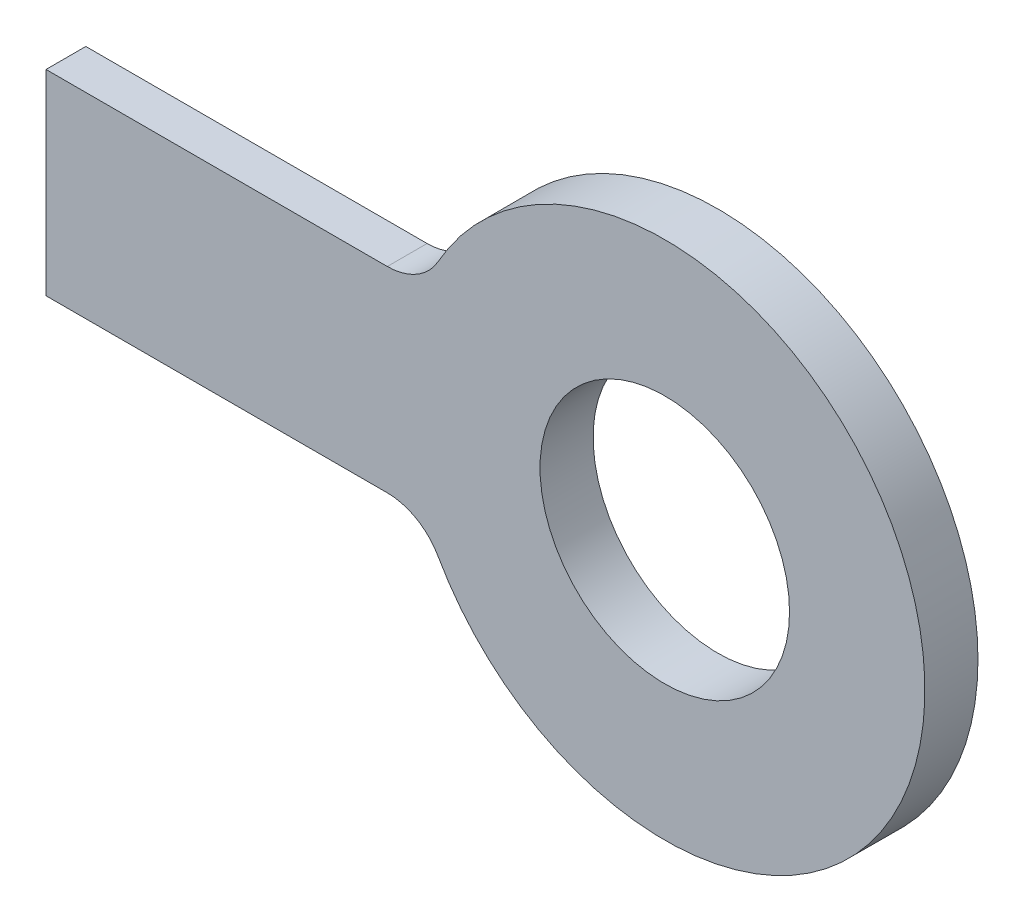
ISO-10303-21;
HEADER;
FILE_DESCRIPTION(('STEP AP214'),'2;1');
FILE_NAME('part.step','',(''),(''),'','','');
FILE_SCHEMA(('AUTOMOTIVE_DESIGN { 1 0 10303 214 1 1 1 1 }'));
ENDSEC;
DATA;
#1=APPLICATION_CONTEXT('core data for automotive mechanical design processes');
#2=APPLICATION_PROTOCOL_DEFINITION('international standard','automotive_design',2000,#1);
#3=PRODUCT_CONTEXT('',#1,'mechanical');
#4=PRODUCT('Part','Part','',(#3));
#5=PRODUCT_RELATED_PRODUCT_CATEGORY('part','',(#4));
#6=PRODUCT_DEFINITION_FORMATION('','',#4);
#7=PRODUCT_DEFINITION_CONTEXT('part definition',#1,'design');
#8=PRODUCT_DEFINITION('design','',#6,#7);
#9=PRODUCT_DEFINITION_SHAPE('','',#8);
#10=(LENGTH_UNIT() NAMED_UNIT(*) SI_UNIT(.MILLI.,.METRE.));
#11=(NAMED_UNIT(*) PLANE_ANGLE_UNIT() SI_UNIT($,.RADIAN.));
#12=(NAMED_UNIT(*) SI_UNIT($,.STERADIAN.) SOLID_ANGLE_UNIT());
#13=UNCERTAINTY_MEASURE_WITH_UNIT(LENGTH_MEASURE(1.E-05),#10,'distance_accuracy_value','');
#14=(GEOMETRIC_REPRESENTATION_CONTEXT(3) GLOBAL_UNCERTAINTY_ASSIGNED_CONTEXT((#13)) GLOBAL_UNIT_ASSIGNED_CONTEXT((#10,
#11,#12)) REPRESENTATION_CONTEXT('',''));
#15=CARTESIAN_POINT('',(0.,0.,0.));
#16=DIRECTION('',(0.,0.,1.));
#17=DIRECTION('',(1.,0.,0.));
#18=AXIS2_PLACEMENT_3D('',#15,#16,#17);
#19=CARTESIAN_POINT('',(-11.887359685943,-2.79480667278133,20.));
#20=DIRECTION('',(0.,0.,-1.));
#21=DIRECTION('',(-1.,0.,0.));
#22=AXIS2_PLACEMENT_3D('',#19,#20,#21);
#23=CYLINDRICAL_SURFACE('',#22,47.);
#24=CARTESIAN_POINT('',(-11.887359685943,-2.79480667278133,20.));
#25=DIRECTION('',(0.,0.,1.));
#26=DIRECTION('',(1.,0.,0.));
#27=AXIS2_PLACEMENT_3D('',#24,#25,#26);
#28=CIRCLE('',#27,47.);
#29=CARTESIAN_POINT('',(35.112640314057,-2.79480667278133,20.));
#30=VERTEX_POINT('',#29);
#31=EDGE_CURVE('E128',#30,#30,#28,.T.);
#32=ORIENTED_EDGE('',*,*,#31,.T.);
#33=EDGE_LOOP('',(#32));
#34=FACE_BOUND('',#33,.T.);
#35=CARTESIAN_POINT('',(-11.887359685943,-2.79480667278133,0.));
#36=DIRECTION('',(0.,0.,1.));
#37=DIRECTION('',(1.,0.,0.));
#38=AXIS2_PLACEMENT_3D('',#35,#36,#37);
#39=CIRCLE('',#38,47.);
#40=CARTESIAN_POINT('',(35.112640314057,-2.79480667278133,0.));
#41=VERTEX_POINT('',#40);
#42=EDGE_CURVE('E126',#41,#41,#39,.T.);
#43=ORIENTED_EDGE('',*,*,#42,.F.);
#44=EDGE_LOOP('',(#43));
#45=FACE_BOUND('',#44,.T.);
#46=ADVANCED_FACE('F43',(#34,#45),#23,.F.);
#47=CARTESIAN_POINT('',(-11.887359685943,-2.79480667278133,20.));
#48=DIRECTION('',(0.,0.,-1.));
#49=DIRECTION('',(-1.,0.,0.));
#50=AXIS2_PLACEMENT_3D('',#47,#48,#49);
#51=CYLINDRICAL_SURFACE('',#50,98.);
#52=CARTESIAN_POINT('',(-11.887359685943,-2.79480667278133,5.));
#53=DIRECTION('',(0.,0.,-1.));
#54=DIRECTION('',(-1.,0.,0.));
#55=AXIS2_PLACEMENT_3D('',#52,#53,#54);
#56=CIRCLE('',#55,98.);
#57=CARTESIAN_POINT('',(-97.2596004938524,-50.9152856753465,5.));
#58=VERTEX_POINT('',#57);
#59=CARTESIAN_POINT('',(-97.2596004938524,45.3256723297838,5.));
#60=VERTEX_POINT('',#59);
#61=EDGE_CURVE('E135',#58,#60,#56,.T.);
#62=ORIENTED_EDGE('',*,*,#61,.T.);
#63=DIRECTION('',(0.,0.,-1.));
#64=VECTOR('',#63,1.);
#65=CARTESIAN_POINT('',(-97.2596004938524,45.3256723297838,20.));
#66=LINE('',#65,#64);
#67=CARTESIAN_POINT('',(-97.2596004938524,45.3256723297838,20.));
#68=VERTEX_POINT('',#67);
#69=EDGE_CURVE('E144',#60,#68,#66,.F.);
#70=ORIENTED_EDGE('',*,*,#69,.T.);
#71=CARTESIAN_POINT('',(-11.887359685943,-2.79480667278133,20.));
#72=DIRECTION('',(0.,0.,1.));
#73=DIRECTION('',(1.,0.,0.));
#74=AXIS2_PLACEMENT_3D('',#71,#72,#73);
#75=CIRCLE('',#74,98.);
#76=CARTESIAN_POINT('',(-97.2596004938524,-50.9152856753465,20.));
#77=VERTEX_POINT('',#76);
#78=EDGE_CURVE('E131',#77,#68,#75,.T.);
#79=ORIENTED_EDGE('',*,*,#78,.F.);
#80=DIRECTION('',(0.,0.,-1.));
#81=VECTOR('',#80,1.);
#82=CARTESIAN_POINT('',(-97.2596004938524,-50.9152856753465,20.));
#83=LINE('',#82,#81);
#84=EDGE_CURVE('E141',#77,#58,#83,.T.);
#85=ORIENTED_EDGE('',*,*,#84,.T.);
#86=EDGE_LOOP('',(#62,#70,#79,#85));
#87=FACE_BOUND('',#86,.T.);
#88=CARTESIAN_POINT('',(-11.887359685943,-2.79480667278133,0.));
#89=DIRECTION('',(0.,0.,1.));
#90=DIRECTION('',(1.,0.,0.));
#91=AXIS2_PLACEMENT_3D('',#88,#89,#90);
#92=CIRCLE('',#91,98.);
#93=CARTESIAN_POINT('',(86.112640314057,-2.79480667278133,0.));
#94=VERTEX_POINT('',#93);
#95=EDGE_CURVE('E132',#94,#94,#92,.T.);
#96=ORIENTED_EDGE('',*,*,#95,.T.);
#97=EDGE_LOOP('',(#96));
#98=FACE_BOUND('',#97,.T.);
#99=ADVANCED_FACE('F159',(#87,#98),#51,.T.);
#100=CARTESIAN_POINT('',(0.,0.,20.));
#101=DIRECTION('',(0.,0.,1.));
#102=DIRECTION('',(1.,0.,0.));
#103=AXIS2_PLACEMENT_3D('',#100,#101,#102);
#104=PLANE('',#103);
#105=DIRECTION('',(1.,0.,0.));
#106=VECTOR('',#105,1.);
#107=CARTESIAN_POINT('',(-102.665602941033,-39.7178421861265,20.));
#108=LINE('',#107,#106);
#109=CARTESIAN_POINT('',(-244.994974098042,-39.7178421861265,20.));
#110=VERTEX_POINT('',#109);
#111=CARTESIAN_POINT('',(-116.424797409914,-39.7178421861265,20.));
#112=VERTEX_POINT('',#111);
#113=EDGE_CURVE('E107',#110,#112,#108,.T.);
#114=ORIENTED_EDGE('',*,*,#113,.T.);
#115=CARTESIAN_POINT('',(-116.424797409914,-61.7178421861265,20.));
#116=DIRECTION('',(0.,0.,1.));
#117=DIRECTION('',(1.,0.,0.));
#118=AXIS2_PLACEMENT_3D('',#115,#116,#117);
#119=CIRCLE('',#118,22.);
#120=EDGE_CURVE('E51',#112,#77,#119,.F.);
#121=ORIENTED_EDGE('',*,*,#120,.T.);
#122=ORIENTED_EDGE('',*,*,#78,.T.);
#123=CARTESIAN_POINT('',(-116.424797409914,56.1282288405638,20.));
#124=DIRECTION('',(0.,0.,1.));
#125=DIRECTION('',(1.,0.,0.));
#126=AXIS2_PLACEMENT_3D('',#123,#124,#125);
#127=CIRCLE('',#126,22.);
#128=CARTESIAN_POINT('',(-116.424797409914,34.1282288405638,20.));
#129=VERTEX_POINT('',#128);
#130=EDGE_CURVE('E150',#68,#129,#127,.F.);
#131=ORIENTED_EDGE('',*,*,#130,.T.);
#132=DIRECTION('',(-1.,0.,0.));
#133=VECTOR('',#132,1.);
#134=CARTESIAN_POINT('',(-102.665602941033,34.1282288405638,20.));
#135=LINE('',#134,#133);
#136=CARTESIAN_POINT('',(-244.994974098042,34.1282288405638,20.));
#137=VERTEX_POINT('',#136);
#138=EDGE_CURVE('E121',#129,#137,#135,.T.);
#139=ORIENTED_EDGE('',*,*,#138,.T.);
#140=DIRECTION('',(0.,-1.,0.));
#141=VECTOR('',#140,1.);
#142=CARTESIAN_POINT('',(-244.994974098042,34.1282288405638,20.));
#143=LINE('',#142,#141);
#144=EDGE_CURVE('E113',#137,#110,#143,.T.);
#145=ORIENTED_EDGE('',*,*,#144,.T.);
#146=EDGE_LOOP('',(#114,#121,#122,#131,#139,#145));
#147=FACE_BOUND('',#146,.T.);
#148=ORIENTED_EDGE('',*,*,#31,.F.);
#149=EDGE_LOOP('',(#148));
#150=FACE_BOUND('',#149,.T.);
#151=ADVANCED_FACE('F155',(#147,#150),#104,.T.);
#152=CARTESIAN_POINT('',(0.,0.,0.));
#153=DIRECTION('',(0.,0.,1.));
#154=DIRECTION('',(1.,0.,0.));
#155=AXIS2_PLACEMENT_3D('',#152,#153,#154);
#156=PLANE('',#155);
#157=ORIENTED_EDGE('',*,*,#42,.T.);
#158=EDGE_LOOP('',(#157));
#159=FACE_BOUND('',#158,.T.);
#160=ORIENTED_EDGE('',*,*,#95,.F.);
#161=EDGE_LOOP('',(#160));
#162=FACE_BOUND('',#161,.T.);
#163=ADVANCED_FACE('F182',(#159,#162),#156,.F.);
#164=CARTESIAN_POINT('',(-102.665602941033,-39.7178421861265,5.));
#165=DIRECTION('',(0.,-1.,0.));
#166=DIRECTION('',(1.,0.,0.));
#167=AXIS2_PLACEMENT_3D('',#164,#165,#166);
#168=PLANE('',#167);
#169=DIRECTION('',(1.,0.,0.));
#170=VECTOR('',#169,1.);
#171=CARTESIAN_POINT('',(-102.665602941033,-39.7178421861265,5.));
#172=LINE('',#171,#170);
#173=CARTESIAN_POINT('',(-244.994974098042,-39.7178421861265,5.));
#174=VERTEX_POINT('',#173);
#175=CARTESIAN_POINT('',(-116.424797409914,-39.7178421861265,5.));
#176=VERTEX_POINT('',#175);
#177=EDGE_CURVE('E115',#174,#176,#172,.T.);
#178=ORIENTED_EDGE('',*,*,#177,.T.);
#179=DIRECTION('',(0.,0.,-1.));
#180=VECTOR('',#179,1.);
#181=CARTESIAN_POINT('',(-116.424797409914,-39.7178421861265,5.));
#182=LINE('',#181,#180);
#183=EDGE_CURVE('E148',#176,#112,#182,.F.);
#184=ORIENTED_EDGE('',*,*,#183,.T.);
#185=ORIENTED_EDGE('',*,*,#113,.F.);
#186=DIRECTION('',(0.,0.,1.));
#187=VECTOR('',#186,1.);
#188=CARTESIAN_POINT('',(-244.994974098042,-39.7178421861265,5.));
#189=LINE('',#188,#187);
#190=EDGE_CURVE('E114',#174,#110,#189,.T.);
#191=ORIENTED_EDGE('',*,*,#190,.F.);
#192=EDGE_LOOP('',(#178,#184,#185,#191));
#193=FACE_BOUND('',#192,.T.);
#194=ADVANCED_FACE('F163',(#193),#168,.T.);
#195=CARTESIAN_POINT('',(-244.994974098042,34.1282288405638,5.));
#196=DIRECTION('',(-1.,0.,0.));
#197=DIRECTION('',(0.,0.,1.));
#198=AXIS2_PLACEMENT_3D('',#195,#196,#197);
#199=PLANE('',#198);
#200=ORIENTED_EDGE('',*,*,#144,.F.);
#201=DIRECTION('',(0.,0.,1.));
#202=VECTOR('',#201,1.);
#203=CARTESIAN_POINT('',(-244.994974098042,34.1282288405638,5.));
#204=LINE('',#203,#202);
#205=CARTESIAN_POINT('',(-244.994974098042,34.1282288405638,5.));
#206=VERTEX_POINT('',#205);
#207=EDGE_CURVE('E99',#206,#137,#204,.T.);
#208=ORIENTED_EDGE('',*,*,#207,.F.);
#209=DIRECTION('',(0.,-1.,0.));
#210=VECTOR('',#209,1.);
#211=CARTESIAN_POINT('',(-244.994974098042,34.1282288405638,5.));
#212=LINE('',#211,#210);
#213=EDGE_CURVE('E106',#206,#174,#212,.T.);
#214=ORIENTED_EDGE('',*,*,#213,.T.);
#215=ORIENTED_EDGE('',*,*,#190,.T.);
#216=EDGE_LOOP('',(#200,#208,#214,#215));
#217=FACE_BOUND('',#216,.T.);
#218=ADVANCED_FACE('F111',(#217),#199,.T.);
#219=CARTESIAN_POINT('',(-102.665602941033,34.1282288405638,5.));
#220=DIRECTION('',(0.,1.,0.));
#221=DIRECTION('',(-1.,0.,0.));
#222=AXIS2_PLACEMENT_3D('',#219,#220,#221);
#223=PLANE('',#222);
#224=ORIENTED_EDGE('',*,*,#138,.F.);
#225=DIRECTION('',(0.,0.,-1.));
#226=VECTOR('',#225,1.);
#227=CARTESIAN_POINT('',(-116.424797409914,34.1282288405638,5.));
#228=LINE('',#227,#226);
#229=CARTESIAN_POINT('',(-116.424797409914,34.1282288405638,5.));
#230=VERTEX_POINT('',#229);
#231=EDGE_CURVE('E102',#129,#230,#228,.T.);
#232=ORIENTED_EDGE('',*,*,#231,.T.);
#233=DIRECTION('',(-1.,0.,0.));
#234=VECTOR('',#233,1.);
#235=CARTESIAN_POINT('',(-102.665602941033,34.1282288405638,5.));
#236=LINE('',#235,#234);
#237=EDGE_CURVE('E95',#230,#206,#236,.T.);
#238=ORIENTED_EDGE('',*,*,#237,.T.);
#239=ORIENTED_EDGE('',*,*,#207,.T.);
#240=EDGE_LOOP('',(#224,#232,#238,#239));
#241=FACE_BOUND('',#240,.T.);
#242=ADVANCED_FACE('F98',(#241),#223,.T.);
#243=CARTESIAN_POINT('',(0.,0.,5.));
#244=DIRECTION('',(0.,0.,-1.));
#245=DIRECTION('',(-1.,0.,0.));
#246=AXIS2_PLACEMENT_3D('',#243,#244,#245);
#247=PLANE('',#246);
#248=ORIENTED_EDGE('',*,*,#61,.F.);
#249=CARTESIAN_POINT('',(-116.424797409914,-61.7178421861265,5.));
#250=DIRECTION('',(0.,0.,-1.));
#251=DIRECTION('',(-1.,0.,0.));
#252=AXIS2_PLACEMENT_3D('',#249,#250,#251);
#253=CIRCLE('',#252,22.);
#254=EDGE_CURVE('E11',#58,#176,#253,.F.);
#255=ORIENTED_EDGE('',*,*,#254,.T.);
#256=ORIENTED_EDGE('',*,*,#177,.F.);
#257=ORIENTED_EDGE('',*,*,#213,.F.);
#258=ORIENTED_EDGE('',*,*,#237,.F.);
#259=CARTESIAN_POINT('',(-116.424797409914,56.1282288405638,5.));
#260=DIRECTION('',(0.,0.,-1.));
#261=DIRECTION('',(-1.,0.,0.));
#262=AXIS2_PLACEMENT_3D('',#259,#260,#261);
#263=CIRCLE('',#262,22.);
#264=EDGE_CURVE('E152',#230,#60,#263,.F.);
#265=ORIENTED_EDGE('',*,*,#264,.T.);
#266=EDGE_LOOP('',(#248,#255,#256,#257,#258,#265));
#267=FACE_BOUND('',#266,.T.);
#268=ADVANCED_FACE('F117',(#267),#247,.T.);
#269=CARTESIAN_POINT('',(-116.424797409914,56.1282288405638,20.));
#270=DIRECTION('',(0.,0.,-1.));
#271=DIRECTION('',(-1.,0.,0.));
#272=AXIS2_PLACEMENT_3D('',#269,#270,#271);
#273=CYLINDRICAL_SURFACE('',#272,22.);
#274=ORIENTED_EDGE('',*,*,#264,.F.);
#275=ORIENTED_EDGE('',*,*,#231,.F.);
#276=ORIENTED_EDGE('',*,*,#130,.F.);
#277=ORIENTED_EDGE('',*,*,#69,.F.);
#278=EDGE_LOOP('',(#274,#275,#276,#277));
#279=FACE_BOUND('',#278,.T.);
#280=ADVANCED_FACE('F165',(#279),#273,.F.);
#281=CARTESIAN_POINT('',(-116.424797409914,-61.7178421861265,20.));
#282=DIRECTION('',(0.,0.,-1.));
#283=DIRECTION('',(-1.,0.,0.));
#284=AXIS2_PLACEMENT_3D('',#281,#282,#283);
#285=CYLINDRICAL_SURFACE('',#284,22.);
#286=ORIENTED_EDGE('',*,*,#254,.F.);
#287=ORIENTED_EDGE('',*,*,#84,.F.);
#288=ORIENTED_EDGE('',*,*,#120,.F.);
#289=ORIENTED_EDGE('',*,*,#183,.F.);
#290=EDGE_LOOP('',(#286,#287,#288,#289));
#291=FACE_BOUND('',#290,.T.);
#292=ADVANCED_FACE('F45',(#291),#285,.F.);
#293=CLOSED_SHELL('',(#46,#99,#151,#163,#194,#218,#242,#268,#280,#292));
#294=MANIFOLD_SOLID_BREP('B2',#293);
#295=ADVANCED_BREP_SHAPE_REPRESENTATION('',(#18,#294),#14);
#296=SHAPE_DEFINITION_REPRESENTATION(#9,#295);
ENDSEC;
END-ISO-10303-21;
